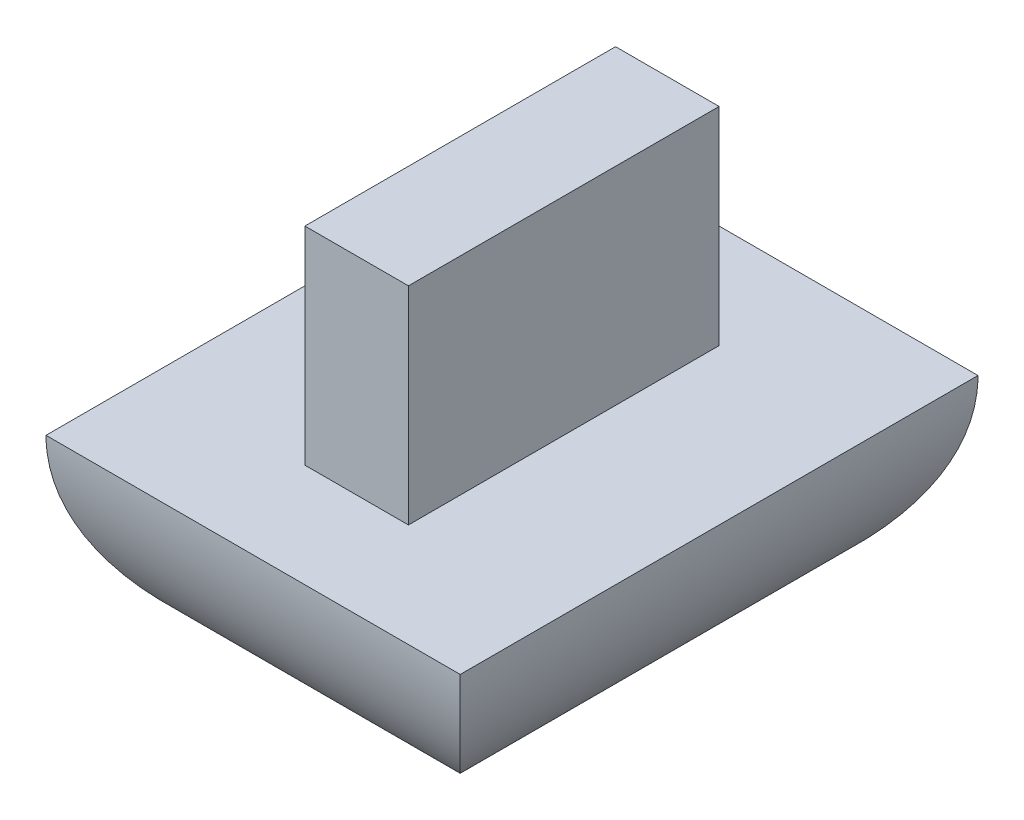
ISO-10303-21;
HEADER;
FILE_DESCRIPTION(('STEP AP214'),'2;1');
FILE_NAME('part.step','',(''),(''),'','','');
FILE_SCHEMA(('AUTOMOTIVE_DESIGN { 1 0 10303 214 1 1 1 1 }'));
ENDSEC;
DATA;
#1=APPLICATION_CONTEXT('core data for automotive mechanical design processes');
#2=APPLICATION_PROTOCOL_DEFINITION('international standard','automotive_design',2000,#1);
#3=PRODUCT_CONTEXT('',#1,'mechanical');
#4=PRODUCT('Part','Part','',(#3));
#5=PRODUCT_RELATED_PRODUCT_CATEGORY('part','',(#4));
#6=PRODUCT_DEFINITION_FORMATION('','',#4);
#7=PRODUCT_DEFINITION_CONTEXT('part definition',#1,'design');
#8=PRODUCT_DEFINITION('design','',#6,#7);
#9=PRODUCT_DEFINITION_SHAPE('','',#8);
#10=(LENGTH_UNIT() NAMED_UNIT(*) SI_UNIT(.MILLI.,.METRE.));
#11=(NAMED_UNIT(*) PLANE_ANGLE_UNIT() SI_UNIT($,.RADIAN.));
#12=(NAMED_UNIT(*) SI_UNIT($,.STERADIAN.) SOLID_ANGLE_UNIT());
#13=UNCERTAINTY_MEASURE_WITH_UNIT(LENGTH_MEASURE(1.E-05),#10,'distance_accuracy_value','');
#14=(GEOMETRIC_REPRESENTATION_CONTEXT(3) GLOBAL_UNCERTAINTY_ASSIGNED_CONTEXT((#13)) GLOBAL_UNIT_ASSIGNED_CONTEXT((#10,
#11,#12)) REPRESENTATION_CONTEXT('',''));
#15=CARTESIAN_POINT('',(0.,0.,0.));
#16=DIRECTION('',(0.,0.,1.));
#17=DIRECTION('',(1.,0.,0.));
#18=AXIS2_PLACEMENT_3D('',#15,#16,#17);
#19=CARTESIAN_POINT('',(0.,0.,0.));
#20=DIRECTION('',(0.,1.,0.));
#21=DIRECTION('',(0.,0.,1.));
#22=AXIS2_PLACEMENT_3D('',#19,#20,#21);
#23=PLANE('',#22);
#24=DIRECTION('',(1.,0.,0.));
#25=VECTOR('',#24,1.);
#26=CARTESIAN_POINT('',(0.,0.,-1.5875));
#27=LINE('',#26,#25);
#28=CARTESIAN_POINT('',(2.38125,0.,-1.5875));
#29=VERTEX_POINT('',#28);
#30=CARTESIAN_POINT('',(3.96875,0.,-1.5875));
#31=VERTEX_POINT('',#30);
#32=EDGE_CURVE('E61',#29,#31,#27,.T.);
#33=ORIENTED_EDGE('',*,*,#32,.F.);
#34=DIRECTION('',(0.,0.,-1.));
#35=VECTOR('',#34,1.);
#36=CARTESIAN_POINT('',(2.38125,0.,0.));
#37=LINE('',#36,#35);
#38=CARTESIAN_POINT('',(2.38125,0.,-6.35));
#39=VERTEX_POINT('',#38);
#40=EDGE_CURVE('E132',#29,#39,#37,.T.);
#41=ORIENTED_EDGE('',*,*,#40,.T.);
#42=DIRECTION('',(1.,0.,0.));
#43=VECTOR('',#42,1.);
#44=CARTESIAN_POINT('',(0.,0.,-6.35));
#45=LINE('',#44,#43);
#46=CARTESIAN_POINT('',(3.96875,0.,-6.35));
#47=VERTEX_POINT('',#46);
#48=EDGE_CURVE('E136',#39,#47,#45,.T.);
#49=ORIENTED_EDGE('',*,*,#48,.T.);
#50=DIRECTION('',(0.,0.,-1.));
#51=VECTOR('',#50,1.);
#52=CARTESIAN_POINT('',(3.96875,0.,0.));
#53=LINE('',#52,#51);
#54=EDGE_CURVE('E139',#31,#47,#53,.T.);
#55=ORIENTED_EDGE('',*,*,#54,.F.);
#56=EDGE_LOOP('',(#33,#41,#49,#55));
#57=FACE_BOUND('',#56,.T.);
#58=DIRECTION('',(1.,0.,0.));
#59=VECTOR('',#58,1.);
#60=CARTESIAN_POINT('',(0.,0.,0.));
#61=LINE('',#60,#59);
#62=CARTESIAN_POINT('',(0.,0.,0.));
#63=VERTEX_POINT('',#62);
#64=CARTESIAN_POINT('',(6.35,0.,0.));
#65=VERTEX_POINT('',#64);
#66=EDGE_CURVE('E112',#63,#65,#61,.T.);
#67=ORIENTED_EDGE('',*,*,#66,.T.);
#68=DIRECTION('',(0.,0.,-1.));
#69=VECTOR('',#68,1.);
#70=CARTESIAN_POINT('',(6.35,0.,0.));
#71=LINE('',#70,#69);
#72=CARTESIAN_POINT('',(6.35,0.,-7.9375));
#73=VERTEX_POINT('',#72);
#74=EDGE_CURVE('E109',#65,#73,#71,.T.);
#75=ORIENTED_EDGE('',*,*,#74,.T.);
#76=DIRECTION('',(1.,0.,0.));
#77=VECTOR('',#76,1.);
#78=CARTESIAN_POINT('',(0.,0.,-7.9375));
#79=LINE('',#78,#77);
#80=CARTESIAN_POINT('',(0.,0.,-7.9375));
#81=VERTEX_POINT('',#80);
#82=EDGE_CURVE('E52',#81,#73,#79,.T.);
#83=ORIENTED_EDGE('',*,*,#82,.F.);
#84=DIRECTION('',(0.,0.,-1.));
#85=VECTOR('',#84,1.);
#86=CARTESIAN_POINT('',(0.,0.,0.));
#87=LINE('',#86,#85);
#88=EDGE_CURVE('E11',#63,#81,#87,.T.);
#89=ORIENTED_EDGE('',*,*,#88,.F.);
#90=EDGE_LOOP('',(#67,#75,#83,#89));
#91=FACE_BOUND('',#90,.T.);
#92=ADVANCED_FACE('F41',(#57,#91),#23,.T.);
#93=CARTESIAN_POINT('',(0.,3.175,-1.5875));
#94=DIRECTION('',(0.,0.,-1.));
#95=DIRECTION('',(-1.,0.,0.));
#96=AXIS2_PLACEMENT_3D('',#93,#94,#95);
#97=PLANE('',#96);
#98=ORIENTED_EDGE('',*,*,#32,.T.);
#99=DIRECTION('',(0.,-1.,0.));
#100=VECTOR('',#99,1.);
#101=CARTESIAN_POINT('',(3.96875,3.175,-1.5875));
#102=LINE('',#101,#100);
#103=CARTESIAN_POINT('',(3.96875,3.175,-1.5875));
#104=VERTEX_POINT('',#103);
#105=EDGE_CURVE('E116',#104,#31,#102,.T.);
#106=ORIENTED_EDGE('',*,*,#105,.F.);
#107=DIRECTION('',(1.,0.,0.));
#108=VECTOR('',#107,1.);
#109=CARTESIAN_POINT('',(0.,3.175,-1.5875));
#110=LINE('',#109,#108);
#111=CARTESIAN_POINT('',(2.38125,3.175,-1.5875));
#112=VERTEX_POINT('',#111);
#113=EDGE_CURVE('E135',#112,#104,#110,.T.);
#114=ORIENTED_EDGE('',*,*,#113,.F.);
#115=DIRECTION('',(0.,-1.,0.));
#116=VECTOR('',#115,1.);
#117=CARTESIAN_POINT('',(2.38125,3.175,-1.5875));
#118=LINE('',#117,#116);
#119=EDGE_CURVE('E128',#112,#29,#118,.T.);
#120=ORIENTED_EDGE('',*,*,#119,.T.);
#121=EDGE_LOOP('',(#98,#106,#114,#120));
#122=FACE_BOUND('',#121,.T.);
#123=ADVANCED_FACE('F170',(#122),#97,.F.);
#124=CARTESIAN_POINT('',(3.96875,3.175,0.));
#125=DIRECTION('',(-1.,0.,0.));
#126=DIRECTION('',(0.,0.,1.));
#127=AXIS2_PLACEMENT_3D('',#124,#125,#126);
#128=PLANE('',#127);
#129=ORIENTED_EDGE('',*,*,#54,.T.);
#130=DIRECTION('',(0.,-1.,0.));
#131=VECTOR('',#130,1.);
#132=CARTESIAN_POINT('',(3.96875,3.175,-6.35));
#133=LINE('',#132,#131);
#134=CARTESIAN_POINT('',(3.96875,3.175,-6.35));
#135=VERTEX_POINT('',#134);
#136=EDGE_CURVE('E120',#135,#47,#133,.T.);
#137=ORIENTED_EDGE('',*,*,#136,.F.);
#138=DIRECTION('',(0.,0.,-1.));
#139=VECTOR('',#138,1.);
#140=CARTESIAN_POINT('',(3.96875,3.175,0.));
#141=LINE('',#140,#139);
#142=EDGE_CURVE('E152',#104,#135,#141,.T.);
#143=ORIENTED_EDGE('',*,*,#142,.F.);
#144=ORIENTED_EDGE('',*,*,#105,.T.);
#145=EDGE_LOOP('',(#129,#137,#143,#144));
#146=FACE_BOUND('',#145,.T.);
#147=ADVANCED_FACE('F172',(#146),#128,.F.);
#148=CARTESIAN_POINT('',(0.,3.175,-6.35));
#149=DIRECTION('',(0.,0.,-1.));
#150=DIRECTION('',(-1.,0.,0.));
#151=AXIS2_PLACEMENT_3D('',#148,#149,#150);
#152=PLANE('',#151);
#153=ORIENTED_EDGE('',*,*,#48,.F.);
#154=DIRECTION('',(0.,-1.,0.));
#155=VECTOR('',#154,1.);
#156=CARTESIAN_POINT('',(2.38125,3.175,-6.35));
#157=LINE('',#156,#155);
#158=CARTESIAN_POINT('',(2.38125,3.175,-6.35));
#159=VERTEX_POINT('',#158);
#160=EDGE_CURVE('E124',#159,#39,#157,.T.);
#161=ORIENTED_EDGE('',*,*,#160,.F.);
#162=DIRECTION('',(1.,0.,0.));
#163=VECTOR('',#162,1.);
#164=CARTESIAN_POINT('',(0.,3.175,-6.35));
#165=LINE('',#164,#163);
#166=EDGE_CURVE('E148',#159,#135,#165,.T.);
#167=ORIENTED_EDGE('',*,*,#166,.T.);
#168=ORIENTED_EDGE('',*,*,#136,.T.);
#169=EDGE_LOOP('',(#153,#161,#167,#168));
#170=FACE_BOUND('',#169,.T.);
#171=ADVANCED_FACE('F187',(#170),#152,.T.);
#172=CARTESIAN_POINT('',(2.38125,3.175,0.));
#173=DIRECTION('',(-1.,0.,0.));
#174=DIRECTION('',(0.,0.,1.));
#175=AXIS2_PLACEMENT_3D('',#172,#173,#174);
#176=PLANE('',#175);
#177=ORIENTED_EDGE('',*,*,#40,.F.);
#178=ORIENTED_EDGE('',*,*,#119,.F.);
#179=DIRECTION('',(0.,0.,-1.));
#180=VECTOR('',#179,1.);
#181=CARTESIAN_POINT('',(2.38125,3.175,0.));
#182=LINE('',#181,#180);
#183=EDGE_CURVE('E131',#112,#159,#182,.T.);
#184=ORIENTED_EDGE('',*,*,#183,.T.);
#185=ORIENTED_EDGE('',*,*,#160,.T.);
#186=EDGE_LOOP('',(#177,#178,#184,#185));
#187=FACE_BOUND('',#186,.T.);
#188=ADVANCED_FACE('F190',(#187),#176,.T.);
#189=CARTESIAN_POINT('',(0.,3.175,0.));
#190=DIRECTION('',(0.,1.,0.));
#191=DIRECTION('',(0.,0.,1.));
#192=AXIS2_PLACEMENT_3D('',#189,#190,#191);
#193=PLANE('',#192);
#194=ORIENTED_EDGE('',*,*,#113,.T.);
#195=ORIENTED_EDGE('',*,*,#142,.T.);
#196=ORIENTED_EDGE('',*,*,#166,.F.);
#197=ORIENTED_EDGE('',*,*,#183,.F.);
#198=EDGE_LOOP('',(#194,#195,#196,#197));
#199=FACE_BOUND('',#198,.T.);
#200=ADVANCED_FACE('F162',(#199),#193,.T.);
#201=CARTESIAN_POINT('',(3.175,0.,0.));
#202=DIRECTION('',(0.,0.,-1.));
#203=DIRECTION('',(-1.,0.,0.));
#204=AXIS2_PLACEMENT_3D('',#201,#202,#203);
#205=CYLINDRICAL_SURFACE('',#204,3.175);
#206=CARTESIAN_POINT('',(3.175,0.,-3.175));
#207=DIRECTION('',(-0.707106781186547,0.,-0.707106781186547));
#208=DIRECTION('',(-0.707106781186547,0.,0.707106781186547));
#209=AXIS2_PLACEMENT_3D('',#206,#207,#208);
#210=ELLIPSE('',#209,4.49012806053458,3.175);
#211=CARTESIAN_POINT('',(3.175,-3.175,-3.175));
#212=VERTEX_POINT('',#211);
#213=EDGE_CURVE('E45',#63,#212,#210,.F.);
#214=ORIENTED_EDGE('',*,*,#213,.F.);
#215=ORIENTED_EDGE('',*,*,#88,.T.);
#216=CARTESIAN_POINT('',(3.175,0.,-4.7625));
#217=DIRECTION('',(0.707106781186547,0.,-0.707106781186547));
#218=DIRECTION('',(-0.707106781186547,0.,-0.707106781186547));
#219=AXIS2_PLACEMENT_3D('',#216,#217,#218);
#220=ELLIPSE('',#219,4.49012806053458,3.175);
#221=CARTESIAN_POINT('',(3.175,-3.175,-4.7625));
#222=VERTEX_POINT('',#221);
#223=EDGE_CURVE('E80',#222,#81,#220,.T.);
#224=ORIENTED_EDGE('',*,*,#223,.F.);
#225=DIRECTION('',(0.,0.,-1.));
#226=VECTOR('',#225,1.);
#227=CARTESIAN_POINT('',(3.175,-3.175,0.));
#228=LINE('',#227,#226);
#229=EDGE_CURVE('E82',#212,#222,#228,.T.);
#230=ORIENTED_EDGE('',*,*,#229,.F.);
#231=EDGE_LOOP('',(#214,#215,#224,#230));
#232=FACE_BOUND('',#231,.T.);
#233=ADVANCED_FACE('F43',(#232),#205,.T.);
#234=CARTESIAN_POINT('',(0.,0.,-3.175));
#235=DIRECTION('',(-1.,0.,0.));
#236=DIRECTION('',(0.,0.,1.));
#237=AXIS2_PLACEMENT_3D('',#234,#235,#236);
#238=CYLINDRICAL_SURFACE('',#237,3.175);
#239=ORIENTED_EDGE('',*,*,#66,.F.);
#240=ORIENTED_EDGE('',*,*,#213,.T.);
#241=CARTESIAN_POINT('',(3.175,0.,-3.175));
#242=DIRECTION('',(-0.707106781186547,0.,0.707106781186547));
#243=DIRECTION('',(-0.707106781186547,0.,-0.707106781186547));
#244=AXIS2_PLACEMENT_3D('',#241,#242,#243);
#245=ELLIPSE('',#244,4.49012806053458,3.175);
#246=EDGE_CURVE('E96',#65,#212,#245,.F.);
#247=ORIENTED_EDGE('',*,*,#246,.F.);
#248=EDGE_LOOP('',(#239,#240,#247));
#249=FACE_BOUND('',#248,.T.);
#250=ADVANCED_FACE('F194',(#249),#238,.T.);
#251=CARTESIAN_POINT('',(0.,0.,-4.7625));
#252=DIRECTION('',(1.,0.,0.));
#253=DIRECTION('',(0.,0.,-1.));
#254=AXIS2_PLACEMENT_3D('',#251,#252,#253);
#255=CYLINDRICAL_SURFACE('',#254,3.175);
#256=ORIENTED_EDGE('',*,*,#223,.T.);
#257=ORIENTED_EDGE('',*,*,#82,.T.);
#258=CARTESIAN_POINT('',(3.175,0.,-4.7625));
#259=DIRECTION('',(0.707106781186547,0.,0.707106781186547));
#260=DIRECTION('',(0.707106781186547,0.,-0.707106781186547));
#261=AXIS2_PLACEMENT_3D('',#258,#259,#260);
#262=ELLIPSE('',#261,4.49012806053458,3.175);
#263=EDGE_CURVE('E95',#222,#73,#262,.T.);
#264=ORIENTED_EDGE('',*,*,#263,.F.);
#265=EDGE_LOOP('',(#256,#257,#264));
#266=FACE_BOUND('',#265,.T.);
#267=ADVANCED_FACE('F99',(#266),#255,.T.);
#268=CARTESIAN_POINT('',(3.175,0.,0.));
#269=DIRECTION('',(0.,0.,1.));
#270=DIRECTION('',(1.,0.,0.));
#271=AXIS2_PLACEMENT_3D('',#268,#269,#270);
#272=CYLINDRICAL_SURFACE('',#271,3.175);
#273=ORIENTED_EDGE('',*,*,#246,.T.);
#274=ORIENTED_EDGE('',*,*,#229,.T.);
#275=ORIENTED_EDGE('',*,*,#263,.T.);
#276=ORIENTED_EDGE('',*,*,#74,.F.);
#277=EDGE_LOOP('',(#273,#274,#275,#276));
#278=FACE_BOUND('',#277,.T.);
#279=ADVANCED_FACE('F92',(#278),#272,.T.);
#280=CLOSED_SHELL('',(#92,#123,#147,#171,#188,#200,#233,#250,#267,#279));
#281=MANIFOLD_SOLID_BREP('B2',#280);
#282=ADVANCED_BREP_SHAPE_REPRESENTATION('',(#18,#281),#14);
#283=SHAPE_DEFINITION_REPRESENTATION(#9,#282);
ENDSEC;
END-ISO-10303-21;
